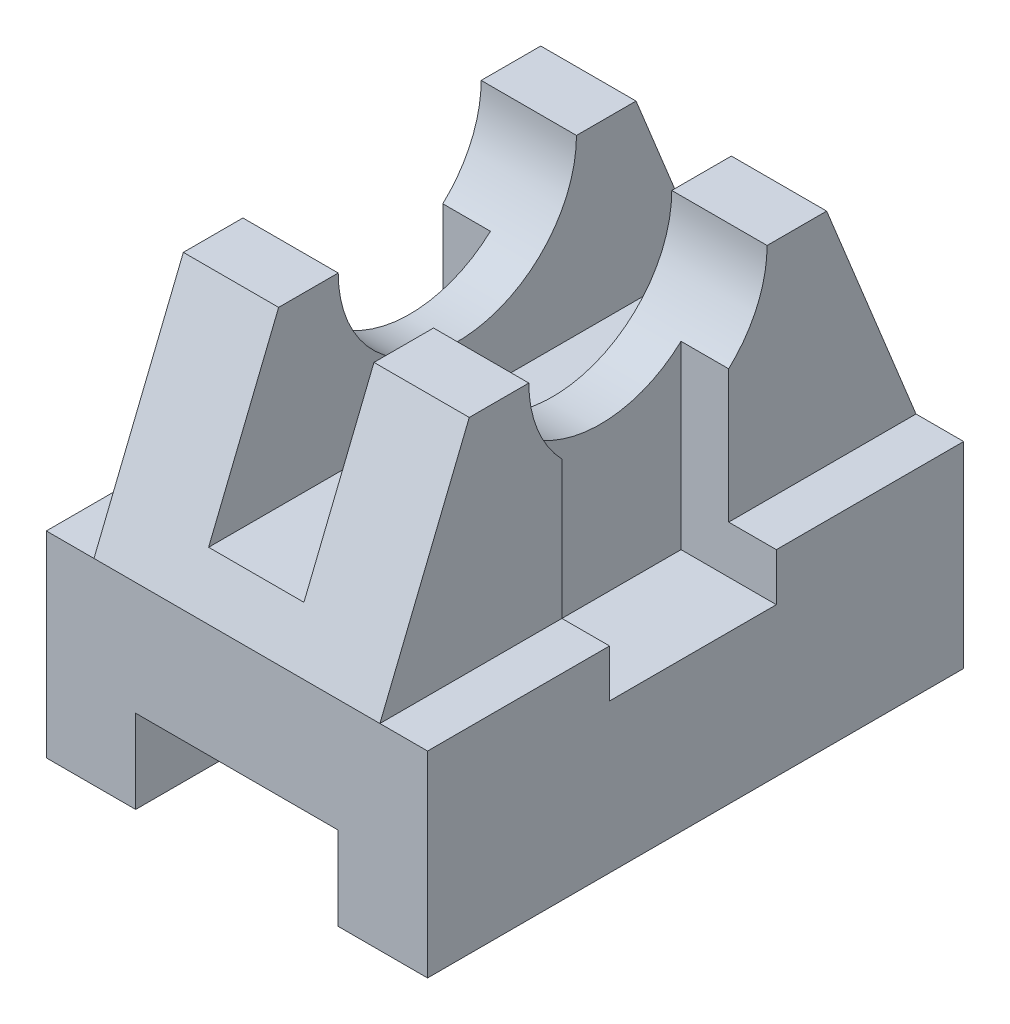
ISO-10303-21;
HEADER;
FILE_DESCRIPTION(('STEP AP214'),'2;1');
FILE_NAME('part.step','',(''),(''),'','','');
FILE_SCHEMA(('AUTOMOTIVE_DESIGN { 1 0 10303 214 1 1 1 1 }'));
ENDSEC;
DATA;
#1=APPLICATION_CONTEXT('core data for automotive mechanical design processes');
#2=APPLICATION_PROTOCOL_DEFINITION('international standard','automotive_design',2000,#1);
#3=PRODUCT_CONTEXT('',#1,'mechanical');
#4=PRODUCT('Part','Part','',(#3));
#5=PRODUCT_RELATED_PRODUCT_CATEGORY('part','',(#4));
#6=PRODUCT_DEFINITION_FORMATION('','',#4);
#7=PRODUCT_DEFINITION_CONTEXT('part definition',#1,'design');
#8=PRODUCT_DEFINITION('design','',#6,#7);
#9=PRODUCT_DEFINITION_SHAPE('','',#8);
#10=(LENGTH_UNIT() NAMED_UNIT(*) SI_UNIT(.MILLI.,.METRE.));
#11=(NAMED_UNIT(*) PLANE_ANGLE_UNIT() SI_UNIT($,.RADIAN.));
#12=(NAMED_UNIT(*) SI_UNIT($,.STERADIAN.) SOLID_ANGLE_UNIT());
#13=UNCERTAINTY_MEASURE_WITH_UNIT(LENGTH_MEASURE(1.E-05),#10,'distance_accuracy_value','');
#14=(GEOMETRIC_REPRESENTATION_CONTEXT(3) GLOBAL_UNCERTAINTY_ASSIGNED_CONTEXT((#13)) GLOBAL_UNIT_ASSIGNED_CONTEXT((#10,
#11,#12)) REPRESENTATION_CONTEXT('',''));
#15=CARTESIAN_POINT('',(0.,0.,0.));
#16=DIRECTION('',(0.,0.,1.));
#17=DIRECTION('',(1.,0.,0.));
#18=AXIS2_PLACEMENT_3D('',#15,#16,#17);
#19=CARTESIAN_POINT('',(48.,49.5,-135.));
#20=DIRECTION('',(0.,1.,0.));
#21=DIRECTION('',(-1.,0.,0.));
#22=AXIS2_PLACEMENT_3D('',#19,#20,#21);
#23=PLANE('',#22);
#24=DIRECTION('',(0.,0.,1.));
#25=VECTOR('',#24,1.);
#26=CARTESIAN_POINT('',(-48.,49.5,-135.));
#27=LINE('',#26,#25);
#28=CARTESIAN_POINT('',(-48.,49.5,-135.));
#29=VERTEX_POINT('',#28);
#30=CARTESIAN_POINT('',(-48.,49.5,-87.8287066394887));
#31=VERTEX_POINT('',#30);
#32=EDGE_CURVE('E468',#29,#31,#27,.T.);
#33=ORIENTED_EDGE('',*,*,#32,.T.);
#34=DIRECTION('',(1.,0.,0.));
#35=VECTOR('',#34,1.);
#36=CARTESIAN_POINT('',(48.,49.5,-87.8287066394886));
#37=LINE('',#36,#35);
#38=CARTESIAN_POINT('',(-36.,49.5,-87.8287066394887));
#39=VERTEX_POINT('',#38);
#40=EDGE_CURVE('E275',#31,#39,#37,.T.);
#41=ORIENTED_EDGE('',*,*,#40,.T.);
#42=DIRECTION('',(0.,0.,-1.));
#43=VECTOR('',#42,1.);
#44=CARTESIAN_POINT('',(-36.,49.5,0.));
#45=LINE('',#44,#43);
#46=CARTESIAN_POINT('',(-36.,49.5,-135.));
#47=VERTEX_POINT('',#46);
#48=EDGE_CURVE('E352',#39,#47,#45,.T.);
#49=ORIENTED_EDGE('',*,*,#48,.T.);
#50=DIRECTION('',(-1.,0.,0.));
#51=VECTOR('',#50,1.);
#52=CARTESIAN_POINT('',(48.,49.5,-135.));
#53=LINE('',#52,#51);
#54=EDGE_CURVE('E406',#47,#29,#53,.T.);
#55=ORIENTED_EDGE('',*,*,#54,.T.);
#56=EDGE_LOOP('',(#33,#41,#49,#55));
#57=FACE_BOUND('',#56,.T.);
#58=ADVANCED_FACE('F33',(#57),#23,.T.);
#59=CARTESIAN_POINT('',(-36.,49.5,0.));
#60=VERTEX_POINT('',#59);
#61=CARTESIAN_POINT('',(-36.,49.5,-45.8287066394887));
#62=VERTEX_POINT('',#61);
#63=EDGE_CURVE('E353',#60,#62,#45,.T.);
#64=ORIENTED_EDGE('',*,*,#63,.T.);
#65=DIRECTION('',(-1.,0.,0.));
#66=VECTOR('',#65,1.);
#67=CARTESIAN_POINT('',(48.,49.5,-45.8287066394887));
#68=LINE('',#67,#66);
#69=CARTESIAN_POINT('',(-48.,49.5,-45.8287066394887));
#70=VERTEX_POINT('',#69);
#71=EDGE_CURVE('E48',#62,#70,#68,.T.);
#72=ORIENTED_EDGE('',*,*,#71,.T.);
#73=CARTESIAN_POINT('',(-48.,49.5,0.));
#74=VERTEX_POINT('',#73);
#75=EDGE_CURVE('E262',#70,#74,#27,.T.);
#76=ORIENTED_EDGE('',*,*,#75,.T.);
#77=DIRECTION('',(-1.,0.,0.));
#78=VECTOR('',#77,1.);
#79=CARTESIAN_POINT('',(48.,49.5,0.));
#80=LINE('',#79,#78);
#81=EDGE_CURVE('E401',#60,#74,#80,.T.);
#82=ORIENTED_EDGE('',*,*,#81,.F.);
#83=EDGE_LOOP('',(#64,#72,#76,#82));
#84=FACE_BOUND('',#83,.T.);
#85=ADVANCED_FACE('F584',(#84),#23,.T.);
#86=CARTESIAN_POINT('',(-48.,49.5,-135.));
#87=DIRECTION('',(-1.,0.,0.));
#88=DIRECTION('',(0.,-1.,0.));
#89=AXIS2_PLACEMENT_3D('',#86,#87,#88);
#90=PLANE('',#89);
#91=DIRECTION('',(0.,0.,-1.));
#92=VECTOR('',#91,1.);
#93=CARTESIAN_POINT('',(-48.,37.5,-87.8287066394887));
#94=LINE('',#93,#92);
#95=CARTESIAN_POINT('',(-48.,37.5,-45.8287066394887));
#96=VERTEX_POINT('',#95);
#97=CARTESIAN_POINT('',(-48.,37.5,-87.8287066394887));
#98=VERTEX_POINT('',#97);
#99=EDGE_CURVE('E250',#96,#98,#94,.T.);
#100=ORIENTED_EDGE('',*,*,#99,.T.);
#101=DIRECTION('',(0.,1.,0.));
#102=VECTOR('',#101,1.);
#103=CARTESIAN_POINT('',(-48.,37.5,-87.8287066394887));
#104=LINE('',#103,#102);
#105=EDGE_CURVE('E271',#98,#31,#104,.T.);
#106=ORIENTED_EDGE('',*,*,#105,.T.);
#107=ORIENTED_EDGE('',*,*,#32,.F.);
#108=DIRECTION('',(0.,-1.,0.));
#109=VECTOR('',#108,1.);
#110=CARTESIAN_POINT('',(-48.,49.5,-135.));
#111=LINE('',#110,#109);
#112=CARTESIAN_POINT('',(-48.,0.,-135.));
#113=VERTEX_POINT('',#112);
#114=EDGE_CURVE('E405',#29,#113,#111,.T.);
#115=ORIENTED_EDGE('',*,*,#114,.T.);
#116=DIRECTION('',(0.,0.,1.));
#117=VECTOR('',#116,1.);
#118=CARTESIAN_POINT('',(-48.,0.,-135.));
#119=LINE('',#118,#117);
#120=CARTESIAN_POINT('',(-48.,0.,0.));
#121=VERTEX_POINT('',#120);
#122=EDGE_CURVE('E466',#113,#121,#119,.T.);
#123=ORIENTED_EDGE('',*,*,#122,.T.);
#124=DIRECTION('',(0.,-1.,0.));
#125=VECTOR('',#124,1.);
#126=CARTESIAN_POINT('',(-48.,49.5,0.));
#127=LINE('',#126,#125);
#128=EDGE_CURVE('E430',#74,#121,#127,.T.);
#129=ORIENTED_EDGE('',*,*,#128,.F.);
#130=ORIENTED_EDGE('',*,*,#75,.F.);
#131=DIRECTION('',(0.,1.,0.));
#132=VECTOR('',#131,1.);
#133=CARTESIAN_POINT('',(-48.,37.5,-45.8287066394887));
#134=LINE('',#133,#132);
#135=EDGE_CURVE('E244',#96,#70,#134,.T.);
#136=ORIENTED_EDGE('',*,*,#135,.F.);
#137=EDGE_LOOP('',(#100,#106,#107,#115,#123,#129,#130,#136));
#138=FACE_BOUND('',#137,.T.);
#139=ADVANCED_FACE('F260',(#138),#90,.T.);
#140=CARTESIAN_POINT('',(36.,105.,-67.5));
#141=DIRECTION('',(-1.,0.,0.));
#142=DIRECTION('',(0.,0.,1.));
#143=AXIS2_PLACEMENT_3D('',#140,#141,#142);
#144=CYLINDRICAL_SURFACE('',#143,30.);
#145=DIRECTION('',(-1.,0.,0.));
#146=VECTOR('',#145,1.);
#147=CARTESIAN_POINT('',(36.,82.9377316133266,-87.8287066394887));
#148=LINE('',#147,#146);
#149=CARTESIAN_POINT('',(-24.,82.9377316133266,-87.8287066394887));
#150=VERTEX_POINT('',#149);
#151=CARTESIAN_POINT('',(-36.,82.9377316133266,-87.8287066394887));
#152=VERTEX_POINT('',#151);
#153=EDGE_CURVE('E273',#150,#152,#148,.T.);
#154=ORIENTED_EDGE('',*,*,#153,.F.);
#155=CARTESIAN_POINT('',(-24.,105.,-67.5));
#156=DIRECTION('',(-1.,0.,0.));
#157=DIRECTION('',(0.,0.,1.));
#158=AXIS2_PLACEMENT_3D('',#155,#156,#157);
#159=CIRCLE('',#158,30.);
#160=CARTESIAN_POINT('',(-24.,84.2549995400661,-45.8287066394887));
#161=VERTEX_POINT('',#160);
#162=EDGE_CURVE('E11',#161,#150,#159,.F.);
#163=ORIENTED_EDGE('',*,*,#162,.F.);
#164=DIRECTION('',(-1.,0.,0.));
#165=VECTOR('',#164,1.);
#166=CARTESIAN_POINT('',(36.,84.2549995400661,-45.8287066394887));
#167=LINE('',#166,#165);
#168=CARTESIAN_POINT('',(-36.,84.2549995400661,-45.8287066394887));
#169=VERTEX_POINT('',#168);
#170=EDGE_CURVE('E269',#169,#161,#167,.F.);
#171=ORIENTED_EDGE('',*,*,#170,.F.);
#172=CARTESIAN_POINT('',(-36.,105.,-67.5));
#173=DIRECTION('',(-1.,0.,0.));
#174=DIRECTION('',(0.,0.,-1.));
#175=AXIS2_PLACEMENT_3D('',#172,#173,#174);
#176=CIRCLE('',#175,30.);
#177=CARTESIAN_POINT('',(-36.,105.,-37.5));
#178=VERTEX_POINT('',#177);
#179=EDGE_CURVE('E342',#169,#178,#176,.T.);
#180=ORIENTED_EDGE('',*,*,#179,.T.);
#181=DIRECTION('',(-1.,0.,0.));
#182=VECTOR('',#181,1.);
#183=CARTESIAN_POINT('',(36.,105.,-37.5));
#184=LINE('',#183,#182);
#185=CARTESIAN_POINT('',(-12.,105.,-37.5));
#186=VERTEX_POINT('',#185);
#187=EDGE_CURVE('E397',#186,#178,#184,.T.);
#188=ORIENTED_EDGE('',*,*,#187,.F.);
#189=CARTESIAN_POINT('',(-12.,105.,-67.5));
#190=DIRECTION('',(-1.,0.,0.));
#191=DIRECTION('',(0.,-1.,0.));
#192=AXIS2_PLACEMENT_3D('',#189,#190,#191);
#193=CIRCLE('',#192,30.);
#194=CARTESIAN_POINT('',(-12.,105.,-97.5));
#195=VERTEX_POINT('',#194);
#196=EDGE_CURVE('E327',#186,#195,#193,.F.);
#197=ORIENTED_EDGE('',*,*,#196,.T.);
#198=DIRECTION('',(-1.,0.,0.));
#199=VECTOR('',#198,1.);
#200=CARTESIAN_POINT('',(36.,105.,-97.5));
#201=LINE('',#200,#199);
#202=CARTESIAN_POINT('',(-36.,105.,-97.5));
#203=VERTEX_POINT('',#202);
#204=EDGE_CURVE('E379',#195,#203,#201,.T.);
#205=ORIENTED_EDGE('',*,*,#204,.T.);
#206=EDGE_CURVE('E343',#203,#152,#176,.T.);
#207=ORIENTED_EDGE('',*,*,#206,.T.);
#208=EDGE_LOOP('',(#154,#163,#171,#180,#188,#197,#205,#207));
#209=FACE_BOUND('',#208,.T.);
#210=ADVANCED_FACE('F520',(#209),#144,.F.);
#211=CARTESIAN_POINT('',(-36.,105.,-67.5));
#212=DIRECTION('',(1.,0.,0.));
#213=DIRECTION('',(0.,0.,-1.));
#214=AXIS2_PLACEMENT_3D('',#211,#212,#213);
#215=PLANE('',#214);
#216=DIRECTION('',(0.,-1.,0.));
#217=VECTOR('',#216,1.);
#218=CARTESIAN_POINT('',(-36.,105.,-87.8287066394887));
#219=LINE('',#218,#217);
#220=EDGE_CURVE('E41',#152,#39,#219,.T.);
#221=ORIENTED_EDGE('',*,*,#220,.F.);
#222=ORIENTED_EDGE('',*,*,#206,.F.);
#223=DIRECTION('',(0.,0.,1.));
#224=VECTOR('',#223,1.);
#225=CARTESIAN_POINT('',(-36.,105.,-97.5));
#226=LINE('',#225,#224);
#227=CARTESIAN_POINT('',(-36.,105.,-112.5));
#228=VERTEX_POINT('',#227);
#229=EDGE_CURVE('E359',#228,#203,#226,.T.);
#230=ORIENTED_EDGE('',*,*,#229,.F.);
#231=DIRECTION('',(0.,0.926739268223405,0.375705108739218));
#232=VECTOR('',#231,1.);
#233=CARTESIAN_POINT('',(-36.,49.5,-135.));
#234=LINE('',#233,#232);
#235=EDGE_CURVE('E356',#47,#228,#234,.T.);
#236=ORIENTED_EDGE('',*,*,#235,.F.);
#237=ORIENTED_EDGE('',*,*,#48,.F.);
#238=EDGE_LOOP('',(#221,#222,#230,#236,#237));
#239=FACE_BOUND('',#238,.T.);
#240=ADVANCED_FACE('F499',(#239),#215,.F.);
#241=DIRECTION('',(0.,1.,0.));
#242=VECTOR('',#241,1.);
#243=CARTESIAN_POINT('',(-36.,105.,-45.8287066394887));
#244=LINE('',#243,#242);
#245=EDGE_CURVE('E486',#62,#169,#244,.T.);
#246=ORIENTED_EDGE('',*,*,#245,.F.);
#247=ORIENTED_EDGE('',*,*,#63,.F.);
#248=DIRECTION('',(0.,-0.926739268223405,0.375705108739218));
#249=VECTOR('',#248,1.);
#250=CARTESIAN_POINT('',(-36.,105.,-22.5));
#251=LINE('',#250,#249);
#252=CARTESIAN_POINT('',(-36.,105.,-22.5));
#253=VERTEX_POINT('',#252);
#254=EDGE_CURVE('E349',#253,#60,#251,.T.);
#255=ORIENTED_EDGE('',*,*,#254,.F.);
#256=DIRECTION('',(0.,0.,1.));
#257=VECTOR('',#256,1.);
#258=CARTESIAN_POINT('',(-36.,105.,-37.5));
#259=LINE('',#258,#257);
#260=EDGE_CURVE('E346',#178,#253,#259,.T.);
#261=ORIENTED_EDGE('',*,*,#260,.F.);
#262=ORIENTED_EDGE('',*,*,#179,.F.);
#263=EDGE_LOOP('',(#246,#247,#255,#261,#262));
#264=FACE_BOUND('',#263,.T.);
#265=ADVANCED_FACE('F538',(#264),#215,.F.);
#266=DIRECTION('',(1.,0.,0.));
#267=VECTOR('',#266,1.);
#268=CARTESIAN_POINT('',(48.,49.5,-45.8287066394887));
#269=LINE('',#268,#267);
#270=CARTESIAN_POINT('',(36.,49.5,-45.8287066394887));
#271=VERTEX_POINT('',#270);
#272=CARTESIAN_POINT('',(48.,49.5,-45.8287066394887));
#273=VERTEX_POINT('',#272);
#274=EDGE_CURVE('E305',#271,#273,#269,.T.);
#275=ORIENTED_EDGE('',*,*,#274,.F.);
#276=DIRECTION('',(0.,0.,-1.));
#277=VECTOR('',#276,1.);
#278=CARTESIAN_POINT('',(36.,49.5,0.));
#279=LINE('',#278,#277);
#280=CARTESIAN_POINT('',(36.,49.5,0.));
#281=VERTEX_POINT('',#280);
#282=EDGE_CURVE('E372',#281,#271,#279,.T.);
#283=ORIENTED_EDGE('',*,*,#282,.F.);
#284=CARTESIAN_POINT('',(48.,49.5,0.));
#285=VERTEX_POINT('',#284);
#286=EDGE_CURVE('E427',#285,#281,#80,.T.);
#287=ORIENTED_EDGE('',*,*,#286,.F.);
#288=DIRECTION('',(0.,0.,1.));
#289=VECTOR('',#288,1.);
#290=CARTESIAN_POINT('',(48.,49.5,-135.));
#291=LINE('',#290,#289);
#292=EDGE_CURVE('E455',#273,#285,#291,.T.);
#293=ORIENTED_EDGE('',*,*,#292,.F.);
#294=EDGE_LOOP('',(#275,#283,#287,#293));
#295=FACE_BOUND('',#294,.T.);
#296=ADVANCED_FACE('F586',(#295),#23,.T.);
#297=CARTESIAN_POINT('',(36.,105.,-67.5));
#298=DIRECTION('',(1.,0.,0.));
#299=DIRECTION('',(0.,0.,-1.));
#300=AXIS2_PLACEMENT_3D('',#297,#298,#299);
#301=PLANE('',#300);
#302=DIRECTION('',(0.,-1.,0.));
#303=VECTOR('',#302,1.);
#304=CARTESIAN_POINT('',(36.,105.,-45.8287066394887));
#305=LINE('',#304,#303);
#306=CARTESIAN_POINT('',(36.,84.2549995400661,-45.8287066394887));
#307=VERTEX_POINT('',#306);
#308=EDGE_CURVE('E481',#307,#271,#305,.T.);
#309=ORIENTED_EDGE('',*,*,#308,.F.);
#310=CARTESIAN_POINT('',(36.,105.,-67.5));
#311=DIRECTION('',(-1.,0.,0.));
#312=DIRECTION('',(0.,0.,-1.));
#313=AXIS2_PLACEMENT_3D('',#310,#311,#312);
#314=CIRCLE('',#313,30.);
#315=CARTESIAN_POINT('',(36.,105.,-37.5));
#316=VERTEX_POINT('',#315);
#317=EDGE_CURVE('E362',#307,#316,#314,.T.);
#318=ORIENTED_EDGE('',*,*,#317,.T.);
#319=DIRECTION('',(0.,0.,1.));
#320=VECTOR('',#319,1.);
#321=CARTESIAN_POINT('',(36.,105.,-37.5));
#322=LINE('',#321,#320);
#323=CARTESIAN_POINT('',(36.,105.,-22.5));
#324=VERTEX_POINT('',#323);
#325=EDGE_CURVE('E366',#316,#324,#322,.T.);
#326=ORIENTED_EDGE('',*,*,#325,.T.);
#327=DIRECTION('',(0.,-0.926739268223405,0.375705108739218));
#328=VECTOR('',#327,1.);
#329=CARTESIAN_POINT('',(36.,105.,-22.5));
#330=LINE('',#329,#328);
#331=EDGE_CURVE('E368',#324,#281,#330,.T.);
#332=ORIENTED_EDGE('',*,*,#331,.T.);
#333=ORIENTED_EDGE('',*,*,#282,.T.);
#334=EDGE_LOOP('',(#309,#318,#326,#332,#333));
#335=FACE_BOUND('',#334,.T.);
#336=ADVANCED_FACE('F592',(#335),#301,.T.);
#337=ORIENTED_EDGE('',*,*,#317,.F.);
#338=DIRECTION('',(-1.,0.,0.));
#339=VECTOR('',#338,1.);
#340=CARTESIAN_POINT('',(36.,84.2549995400661,-45.8287066394887));
#341=LINE('',#340,#339);
#342=CARTESIAN_POINT('',(24.,84.2549995400661,-45.8287066394887));
#343=VERTEX_POINT('',#342);
#344=EDGE_CURVE('E307',#307,#343,#341,.T.);
#345=ORIENTED_EDGE('',*,*,#344,.T.);
#346=CARTESIAN_POINT('',(24.,105.,-67.5));
#347=DIRECTION('',(-1.,0.,0.));
#348=DIRECTION('',(0.,0.,1.));
#349=AXIS2_PLACEMENT_3D('',#346,#347,#348);
#350=CIRCLE('',#349,30.);
#351=CARTESIAN_POINT('',(24.,82.9377316133266,-87.8287066394887));
#352=VERTEX_POINT('',#351);
#353=EDGE_CURVE('E483',#343,#352,#350,.F.);
#354=ORIENTED_EDGE('',*,*,#353,.T.);
#355=DIRECTION('',(-1.,0.,0.));
#356=VECTOR('',#355,1.);
#357=CARTESIAN_POINT('',(36.,82.9377316133266,-87.8287066394887));
#358=LINE('',#357,#356);
#359=CARTESIAN_POINT('',(36.,82.9377316133266,-87.8287066394887));
#360=VERTEX_POINT('',#359);
#361=EDGE_CURVE('E302',#352,#360,#358,.F.);
#362=ORIENTED_EDGE('',*,*,#361,.T.);
#363=CARTESIAN_POINT('',(36.,105.,-97.5));
#364=VERTEX_POINT('',#363);
#365=EDGE_CURVE('E363',#364,#360,#314,.T.);
#366=ORIENTED_EDGE('',*,*,#365,.F.);
#367=CARTESIAN_POINT('',(12.,105.,-97.5));
#368=VERTEX_POINT('',#367);
#369=EDGE_CURVE('E380',#364,#368,#201,.T.);
#370=ORIENTED_EDGE('',*,*,#369,.T.);
#371=CARTESIAN_POINT('',(12.,105.,-67.5));
#372=DIRECTION('',(1.,0.,0.));
#373=DIRECTION('',(0.,1.,0.));
#374=AXIS2_PLACEMENT_3D('',#371,#372,#373);
#375=CIRCLE('',#374,30.);
#376=CARTESIAN_POINT('',(12.,105.,-37.5));
#377=VERTEX_POINT('',#376);
#378=EDGE_CURVE('E336',#368,#377,#375,.F.);
#379=ORIENTED_EDGE('',*,*,#378,.T.);
#380=EDGE_CURVE('E398',#316,#377,#184,.T.);
#381=ORIENTED_EDGE('',*,*,#380,.F.);
#382=EDGE_LOOP('',(#337,#345,#354,#362,#366,#370,#379,#381));
#383=FACE_BOUND('',#382,.T.);
#384=ADVANCED_FACE('F598',(#383),#144,.F.);
#385=CARTESIAN_POINT('',(36.,105.,-37.5));
#386=DIRECTION('',(0.,-1.,0.));
#387=DIRECTION('',(0.,0.,-1.));
#388=AXIS2_PLACEMENT_3D('',#385,#386,#387);
#389=PLANE('',#388);
#390=ORIENTED_EDGE('',*,*,#380,.T.);
#391=DIRECTION('',(0.,0.,1.));
#392=VECTOR('',#391,1.);
#393=CARTESIAN_POINT('',(12.,105.,-135.));
#394=LINE('',#393,#392);
#395=CARTESIAN_POINT('',(12.,105.,-22.5));
#396=VERTEX_POINT('',#395);
#397=EDGE_CURVE('E310',#377,#396,#394,.T.);
#398=ORIENTED_EDGE('',*,*,#397,.T.);
#399=DIRECTION('',(-1.,0.,0.));
#400=VECTOR('',#399,1.);
#401=CARTESIAN_POINT('',(36.,105.,-22.5));
#402=LINE('',#401,#400);
#403=EDGE_CURVE('E394',#324,#396,#402,.T.);
#404=ORIENTED_EDGE('',*,*,#403,.F.);
#405=ORIENTED_EDGE('',*,*,#325,.F.);
#406=EDGE_LOOP('',(#390,#398,#404,#405));
#407=FACE_BOUND('',#406,.T.);
#408=ADVANCED_FACE('F610',(#407),#389,.F.);
#409=CARTESIAN_POINT('',(36.,105.,-97.5));
#410=DIRECTION('',(0.,-1.,0.));
#411=DIRECTION('',(0.,0.,-1.));
#412=AXIS2_PLACEMENT_3D('',#409,#410,#411);
#413=PLANE('',#412);
#414=DIRECTION('',(-1.,0.,0.));
#415=VECTOR('',#414,1.);
#416=CARTESIAN_POINT('',(36.,105.,-112.5));
#417=LINE('',#416,#415);
#418=CARTESIAN_POINT('',(36.,105.,-112.5));
#419=VERTEX_POINT('',#418);
#420=CARTESIAN_POINT('',(12.,105.,-112.5));
#421=VERTEX_POINT('',#420);
#422=EDGE_CURVE('E384',#419,#421,#417,.T.);
#423=ORIENTED_EDGE('',*,*,#422,.T.);
#424=DIRECTION('',(0.,0.,1.));
#425=VECTOR('',#424,1.);
#426=CARTESIAN_POINT('',(12.,105.,-97.5));
#427=LINE('',#426,#425);
#428=EDGE_CURVE('E473',#421,#368,#427,.T.);
#429=ORIENTED_EDGE('',*,*,#428,.T.);
#430=ORIENTED_EDGE('',*,*,#369,.F.);
#431=DIRECTION('',(0.,0.,1.));
#432=VECTOR('',#431,1.);
#433=CARTESIAN_POINT('',(36.,105.,-97.5));
#434=LINE('',#433,#432);
#435=EDGE_CURVE('E377',#419,#364,#434,.T.);
#436=ORIENTED_EDGE('',*,*,#435,.F.);
#437=EDGE_LOOP('',(#423,#429,#430,#436));
#438=FACE_BOUND('',#437,.T.);
#439=ADVANCED_FACE('F550',(#438),#413,.F.);
#440=DIRECTION('',(-1.,0.,0.));
#441=VECTOR('',#440,1.);
#442=CARTESIAN_POINT('',(48.,49.5,-87.8287066394887));
#443=LINE('',#442,#441);
#444=CARTESIAN_POINT('',(48.,49.5,-87.8287066394887));
#445=VERTEX_POINT('',#444);
#446=CARTESIAN_POINT('',(36.,49.5,-87.8287066394887));
#447=VERTEX_POINT('',#446);
#448=EDGE_CURVE('E56',#445,#447,#443,.T.);
#449=ORIENTED_EDGE('',*,*,#448,.F.);
#450=CARTESIAN_POINT('',(48.,49.5,-135.));
#451=VERTEX_POINT('',#450);
#452=EDGE_CURVE('E451',#451,#445,#291,.T.);
#453=ORIENTED_EDGE('',*,*,#452,.F.);
#454=CARTESIAN_POINT('',(36.,49.5,-135.));
#455=VERTEX_POINT('',#454);
#456=EDGE_CURVE('E402',#451,#455,#53,.T.);
#457=ORIENTED_EDGE('',*,*,#456,.T.);
#458=EDGE_CURVE('E371',#447,#455,#279,.T.);
#459=ORIENTED_EDGE('',*,*,#458,.F.);
#460=EDGE_LOOP('',(#449,#453,#457,#459));
#461=FACE_BOUND('',#460,.T.);
#462=ADVANCED_FACE('F35',(#461),#23,.T.);
#463=CARTESIAN_POINT('',(48.,0.,-135.));
#464=DIRECTION('',(1.,0.,0.));
#465=DIRECTION('',(0.,0.,-1.));
#466=AXIS2_PLACEMENT_3D('',#463,#464,#465);
#467=PLANE('',#466);
#468=DIRECTION('',(0.,1.,0.));
#469=VECTOR('',#468,1.);
#470=CARTESIAN_POINT('',(48.,37.5,-45.8287066394887));
#471=LINE('',#470,#469);
#472=CARTESIAN_POINT('',(48.,37.5,-45.8287066394887));
#473=VERTEX_POINT('',#472);
#474=EDGE_CURVE('E291',#473,#273,#471,.T.);
#475=ORIENTED_EDGE('',*,*,#474,.T.);
#476=ORIENTED_EDGE('',*,*,#292,.T.);
#477=DIRECTION('',(0.,1.,0.));
#478=VECTOR('',#477,1.);
#479=CARTESIAN_POINT('',(48.,0.,0.));
#480=LINE('',#479,#478);
#481=CARTESIAN_POINT('',(48.,0.,0.));
#482=VERTEX_POINT('',#481);
#483=EDGE_CURVE('E448',#482,#285,#480,.T.);
#484=ORIENTED_EDGE('',*,*,#483,.F.);
#485=DIRECTION('',(0.,0.,1.));
#486=VECTOR('',#485,1.);
#487=CARTESIAN_POINT('',(48.,0.,-135.));
#488=LINE('',#487,#486);
#489=CARTESIAN_POINT('',(48.,0.,-135.));
#490=VERTEX_POINT('',#489);
#491=EDGE_CURVE('E456',#490,#482,#488,.T.);
#492=ORIENTED_EDGE('',*,*,#491,.F.);
#493=DIRECTION('',(0.,1.,0.));
#494=VECTOR('',#493,1.);
#495=CARTESIAN_POINT('',(48.,0.,-135.));
#496=LINE('',#495,#494);
#497=EDGE_CURVE('E424',#490,#451,#496,.T.);
#498=ORIENTED_EDGE('',*,*,#497,.T.);
#499=ORIENTED_EDGE('',*,*,#452,.T.);
#500=DIRECTION('',(0.,1.,0.));
#501=VECTOR('',#500,1.);
#502=CARTESIAN_POINT('',(48.,37.5,-87.8287066394887));
#503=LINE('',#502,#501);
#504=CARTESIAN_POINT('',(48.,37.5,-87.8287066394887));
#505=VERTEX_POINT('',#504);
#506=EDGE_CURVE('E290',#505,#445,#503,.T.);
#507=ORIENTED_EDGE('',*,*,#506,.F.);
#508=DIRECTION('',(0.,0.,-1.));
#509=VECTOR('',#508,1.);
#510=CARTESIAN_POINT('',(48.,37.5,-87.8287066394887));
#511=LINE('',#510,#509);
#512=EDGE_CURVE('E278',#473,#505,#511,.T.);
#513=ORIENTED_EDGE('',*,*,#512,.F.);
#514=EDGE_LOOP('',(#475,#476,#484,#492,#498,#499,#507,#513));
#515=FACE_BOUND('',#514,.T.);
#516=ADVANCED_FACE('F559',(#515),#467,.T.);
#517=CARTESIAN_POINT('',(25.5,0.,-135.));
#518=DIRECTION('',(0.,-1.,0.));
#519=DIRECTION('',(0.,0.,-1.));
#520=AXIS2_PLACEMENT_3D('',#517,#518,#519);
#521=PLANE('',#520);
#522=DIRECTION('',(1.,0.,0.));
#523=VECTOR('',#522,1.);
#524=CARTESIAN_POINT('',(25.5,0.,0.));
#525=LINE('',#524,#523);
#526=CARTESIAN_POINT('',(25.5,0.,0.));
#527=VERTEX_POINT('',#526);
#528=EDGE_CURVE('E445',#527,#482,#525,.T.);
#529=ORIENTED_EDGE('',*,*,#528,.F.);
#530=DIRECTION('',(0.,0.,1.));
#531=VECTOR('',#530,1.);
#532=CARTESIAN_POINT('',(25.5,0.,-135.));
#533=LINE('',#532,#531);
#534=CARTESIAN_POINT('',(25.5,0.,-135.));
#535=VERTEX_POINT('',#534);
#536=EDGE_CURVE('E458',#535,#527,#533,.T.);
#537=ORIENTED_EDGE('',*,*,#536,.F.);
#538=DIRECTION('',(1.,0.,0.));
#539=VECTOR('',#538,1.);
#540=CARTESIAN_POINT('',(25.5,0.,-135.));
#541=LINE('',#540,#539);
#542=EDGE_CURVE('E421',#535,#490,#541,.T.);
#543=ORIENTED_EDGE('',*,*,#542,.T.);
#544=ORIENTED_EDGE('',*,*,#491,.T.);
#545=EDGE_LOOP('',(#529,#537,#543,#544));
#546=FACE_BOUND('',#545,.T.);
#547=ADVANCED_FACE('F608',(#546),#521,.T.);
#548=CARTESIAN_POINT('',(25.5,21.,-135.));
#549=DIRECTION('',(-1.,0.,0.));
#550=DIRECTION('',(0.,-1.,0.));
#551=AXIS2_PLACEMENT_3D('',#548,#549,#550);
#552=PLANE('',#551);
#553=DIRECTION('',(0.,-1.,0.));
#554=VECTOR('',#553,1.);
#555=CARTESIAN_POINT('',(25.5,21.,0.));
#556=LINE('',#555,#554);
#557=CARTESIAN_POINT('',(25.5,21.,0.));
#558=VERTEX_POINT('',#557);
#559=EDGE_CURVE('E442',#558,#527,#556,.T.);
#560=ORIENTED_EDGE('',*,*,#559,.F.);
#561=DIRECTION('',(0.,0.,1.));
#562=VECTOR('',#561,1.);
#563=CARTESIAN_POINT('',(25.5,21.,-135.));
#564=LINE('',#563,#562);
#565=CARTESIAN_POINT('',(25.5,21.,-135.));
#566=VERTEX_POINT('',#565);
#567=EDGE_CURVE('E460',#566,#558,#564,.T.);
#568=ORIENTED_EDGE('',*,*,#567,.F.);
#569=DIRECTION('',(0.,-1.,0.));
#570=VECTOR('',#569,1.);
#571=CARTESIAN_POINT('',(25.5,21.,-135.));
#572=LINE('',#571,#570);
#573=EDGE_CURVE('E418',#566,#535,#572,.T.);
#574=ORIENTED_EDGE('',*,*,#573,.T.);
#575=ORIENTED_EDGE('',*,*,#536,.T.);
#576=EDGE_LOOP('',(#560,#568,#574,#575));
#577=FACE_BOUND('',#576,.T.);
#578=ADVANCED_FACE('F568',(#577),#552,.T.);
#579=CARTESIAN_POINT('',(-25.5,21.,-135.));
#580=DIRECTION('',(0.,-1.,0.));
#581=DIRECTION('',(0.,0.,-1.));
#582=AXIS2_PLACEMENT_3D('',#579,#580,#581);
#583=PLANE('',#582);
#584=DIRECTION('',(1.,0.,0.));
#585=VECTOR('',#584,1.);
#586=CARTESIAN_POINT('',(-25.5,21.,0.));
#587=LINE('',#586,#585);
#588=CARTESIAN_POINT('',(-25.5,21.,0.));
#589=VERTEX_POINT('',#588);
#590=EDGE_CURVE('E439',#589,#558,#587,.T.);
#591=ORIENTED_EDGE('',*,*,#590,.F.);
#592=DIRECTION('',(0.,0.,1.));
#593=VECTOR('',#592,1.);
#594=CARTESIAN_POINT('',(-25.5,21.,-135.));
#595=LINE('',#594,#593);
#596=CARTESIAN_POINT('',(-25.5,21.,-135.));
#597=VERTEX_POINT('',#596);
#598=EDGE_CURVE('E462',#597,#589,#595,.T.);
#599=ORIENTED_EDGE('',*,*,#598,.F.);
#600=DIRECTION('',(1.,0.,0.));
#601=VECTOR('',#600,1.);
#602=CARTESIAN_POINT('',(-25.5,21.,-135.));
#603=LINE('',#602,#601);
#604=EDGE_CURVE('E415',#597,#566,#603,.T.);
#605=ORIENTED_EDGE('',*,*,#604,.T.);
#606=ORIENTED_EDGE('',*,*,#567,.T.);
#607=EDGE_LOOP('',(#591,#599,#605,#606));
#608=FACE_BOUND('',#607,.T.);
#609=ADVANCED_FACE('F572',(#608),#583,.T.);
#610=CARTESIAN_POINT('',(-25.5,0.,-135.));
#611=DIRECTION('',(1.,0.,0.));
#612=DIRECTION('',(0.,1.,0.));
#613=AXIS2_PLACEMENT_3D('',#610,#611,#612);
#614=PLANE('',#613);
#615=DIRECTION('',(0.,1.,0.));
#616=VECTOR('',#615,1.);
#617=CARTESIAN_POINT('',(-25.5,0.,0.));
#618=LINE('',#617,#616);
#619=CARTESIAN_POINT('',(-25.5,0.,0.));
#620=VERTEX_POINT('',#619);
#621=EDGE_CURVE('E436',#620,#589,#618,.T.);
#622=ORIENTED_EDGE('',*,*,#621,.F.);
#623=DIRECTION('',(0.,0.,1.));
#624=VECTOR('',#623,1.);
#625=CARTESIAN_POINT('',(-25.5,0.,-135.));
#626=LINE('',#625,#624);
#627=CARTESIAN_POINT('',(-25.5,0.,-135.));
#628=VERTEX_POINT('',#627);
#629=EDGE_CURVE('E464',#628,#620,#626,.T.);
#630=ORIENTED_EDGE('',*,*,#629,.F.);
#631=DIRECTION('',(0.,1.,0.));
#632=VECTOR('',#631,1.);
#633=CARTESIAN_POINT('',(-25.5,0.,-135.));
#634=LINE('',#633,#632);
#635=EDGE_CURVE('E412',#628,#597,#634,.T.);
#636=ORIENTED_EDGE('',*,*,#635,.T.);
#637=ORIENTED_EDGE('',*,*,#598,.T.);
#638=EDGE_LOOP('',(#622,#630,#636,#637));
#639=FACE_BOUND('',#638,.T.);
#640=ADVANCED_FACE('F576',(#639),#614,.T.);
#641=CARTESIAN_POINT('',(-48.,0.,-135.));
#642=DIRECTION('',(0.,-1.,0.));
#643=DIRECTION('',(1.,0.,0.));
#644=AXIS2_PLACEMENT_3D('',#641,#642,#643);
#645=PLANE('',#644);
#646=DIRECTION('',(1.,0.,0.));
#647=VECTOR('',#646,1.);
#648=CARTESIAN_POINT('',(-48.,0.,0.));
#649=LINE('',#648,#647);
#650=EDGE_CURVE('E433',#121,#620,#649,.T.);
#651=ORIENTED_EDGE('',*,*,#650,.F.);
#652=ORIENTED_EDGE('',*,*,#122,.F.);
#653=DIRECTION('',(1.,0.,0.));
#654=VECTOR('',#653,1.);
#655=CARTESIAN_POINT('',(-48.,0.,-135.));
#656=LINE('',#655,#654);
#657=EDGE_CURVE('E409',#113,#628,#656,.T.);
#658=ORIENTED_EDGE('',*,*,#657,.T.);
#659=ORIENTED_EDGE('',*,*,#629,.T.);
#660=EDGE_LOOP('',(#651,#652,#658,#659));
#661=FACE_BOUND('',#660,.T.);
#662=ADVANCED_FACE('F579',(#661),#645,.T.);
#663=CARTESIAN_POINT('',(0.,0.,-135.));
#664=DIRECTION('',(0.,0.,1.));
#665=DIRECTION('',(1.,0.,0.));
#666=AXIS2_PLACEMENT_3D('',#663,#664,#665);
#667=PLANE('',#666);
#668=ORIENTED_EDGE('',*,*,#456,.F.);
#669=ORIENTED_EDGE('',*,*,#497,.F.);
#670=ORIENTED_EDGE('',*,*,#542,.F.);
#671=ORIENTED_EDGE('',*,*,#573,.F.);
#672=ORIENTED_EDGE('',*,*,#604,.F.);
#673=ORIENTED_EDGE('',*,*,#635,.F.);
#674=ORIENTED_EDGE('',*,*,#657,.F.);
#675=ORIENTED_EDGE('',*,*,#114,.F.);
#676=ORIENTED_EDGE('',*,*,#54,.F.);
#677=DIRECTION('',(-1.,0.,0.));
#678=VECTOR('',#677,1.);
#679=CARTESIAN_POINT('',(36.,49.5,-135.));
#680=LINE('',#679,#678);
#681=EDGE_CURVE('E387',#455,#47,#680,.T.);
#682=ORIENTED_EDGE('',*,*,#681,.F.);
#683=EDGE_LOOP('',(#668,#669,#670,#671,#672,#673,#674,#675,#676,#682));
#684=FACE_BOUND('',#683,.T.);
#685=ADVANCED_FACE('F509',(#684),#667,.F.);
#686=CARTESIAN_POINT('',(0.,0.,0.));
#687=DIRECTION('',(0.,0.,1.));
#688=DIRECTION('',(1.,0.,0.));
#689=AXIS2_PLACEMENT_3D('',#686,#687,#688);
#690=PLANE('',#689);
#691=ORIENTED_EDGE('',*,*,#286,.T.);
#692=DIRECTION('',(-1.,0.,0.));
#693=VECTOR('',#692,1.);
#694=CARTESIAN_POINT('',(36.,49.5,0.));
#695=LINE('',#694,#693);
#696=EDGE_CURVE('E390',#281,#60,#695,.T.);
#697=ORIENTED_EDGE('',*,*,#696,.T.);
#698=ORIENTED_EDGE('',*,*,#81,.T.);
#699=ORIENTED_EDGE('',*,*,#128,.T.);
#700=ORIENTED_EDGE('',*,*,#650,.T.);
#701=ORIENTED_EDGE('',*,*,#621,.T.);
#702=ORIENTED_EDGE('',*,*,#590,.T.);
#703=ORIENTED_EDGE('',*,*,#559,.T.);
#704=ORIENTED_EDGE('',*,*,#528,.T.);
#705=ORIENTED_EDGE('',*,*,#483,.T.);
#706=EDGE_LOOP('',(#691,#697,#698,#699,#700,#701,#702,#703,#704,#705));
#707=FACE_BOUND('',#706,.T.);
#708=ADVANCED_FACE('F582',(#707),#690,.T.);
#709=CARTESIAN_POINT('',(-12.,105.,-22.5));
#710=VERTEX_POINT('',#709);
#711=EDGE_CURVE('E393',#710,#253,#402,.T.);
#712=ORIENTED_EDGE('',*,*,#711,.F.);
#713=DIRECTION('',(0.,0.,1.));
#714=VECTOR('',#713,1.);
#715=CARTESIAN_POINT('',(-12.,105.,-135.));
#716=LINE('',#715,#714);
#717=EDGE_CURVE('E318',#186,#710,#716,.T.);
#718=ORIENTED_EDGE('',*,*,#717,.F.);
#719=ORIENTED_EDGE('',*,*,#187,.T.);
#720=ORIENTED_EDGE('',*,*,#260,.T.);
#721=EDGE_LOOP('',(#712,#718,#719,#720));
#722=FACE_BOUND('',#721,.T.);
#723=ADVANCED_FACE('F535',(#722),#389,.F.);
#724=CARTESIAN_POINT('',(36.,105.,-22.5));
#725=DIRECTION('',(0.,-0.375705108739218,-0.926739268223405));
#726=DIRECTION('',(0.,0.926739268223405,-0.375705108739218));
#727=AXIS2_PLACEMENT_3D('',#724,#725,#726);
#728=PLANE('',#727);
#729=ORIENTED_EDGE('',*,*,#403,.T.);
#730=DIRECTION('',(0.,-0.926739268223405,0.375705108739218));
#731=VECTOR('',#730,1.);
#732=CARTESIAN_POINT('',(12.,105.,-22.5));
#733=LINE('',#732,#731);
#734=CARTESIAN_POINT('',(12.,61.5,-4.86486486486487));
#735=VERTEX_POINT('',#734);
#736=EDGE_CURVE('E333',#396,#735,#733,.T.);
#737=ORIENTED_EDGE('',*,*,#736,.T.);
#738=DIRECTION('',(-1.,0.,0.));
#739=VECTOR('',#738,1.);
#740=CARTESIAN_POINT('',(36.,61.5,-4.86486486486487));
#741=LINE('',#740,#739);
#742=CARTESIAN_POINT('',(-12.,61.5,-4.86486486486488));
#743=VERTEX_POINT('',#742);
#744=EDGE_CURVE('E339',#735,#743,#741,.T.);
#745=ORIENTED_EDGE('',*,*,#744,.T.);
#746=DIRECTION('',(0.,0.926739268223405,-0.375705108739218));
#747=VECTOR('',#746,1.);
#748=CARTESIAN_POINT('',(-12.,105.,-22.5));
#749=LINE('',#748,#747);
#750=EDGE_CURVE('E324',#743,#710,#749,.T.);
#751=ORIENTED_EDGE('',*,*,#750,.T.);
#752=ORIENTED_EDGE('',*,*,#711,.T.);
#753=ORIENTED_EDGE('',*,*,#254,.T.);
#754=ORIENTED_EDGE('',*,*,#696,.F.);
#755=ORIENTED_EDGE('',*,*,#331,.F.);
#756=EDGE_LOOP('',(#729,#737,#745,#751,#752,#753,#754,#755));
#757=FACE_BOUND('',#756,.T.);
#758=ADVANCED_FACE('F542',(#757),#728,.F.);
#759=CARTESIAN_POINT('',(36.,49.5,-135.));
#760=DIRECTION('',(0.,-0.375705108739218,0.926739268223405));
#761=DIRECTION('',(0.,-0.926739268223405,-0.375705108739218));
#762=AXIS2_PLACEMENT_3D('',#759,#760,#761);
#763=PLANE('',#762);
#764=DIRECTION('',(1.,0.,0.));
#765=VECTOR('',#764,1.);
#766=CARTESIAN_POINT('',(36.,61.5,-130.135135135135));
#767=LINE('',#766,#765);
#768=CARTESIAN_POINT('',(-12.,61.5,-130.135135135135));
#769=VERTEX_POINT('',#768);
#770=CARTESIAN_POINT('',(12.,61.5,-130.135135135135));
#771=VERTEX_POINT('',#770);
#772=EDGE_CURVE('E476',#769,#771,#767,.T.);
#773=ORIENTED_EDGE('',*,*,#772,.T.);
#774=DIRECTION('',(0.,0.926739268223405,0.375705108739218));
#775=VECTOR('',#774,1.);
#776=CARTESIAN_POINT('',(12.,49.5,-135.));
#777=LINE('',#776,#775);
#778=EDGE_CURVE('E330',#771,#421,#777,.T.);
#779=ORIENTED_EDGE('',*,*,#778,.T.);
#780=ORIENTED_EDGE('',*,*,#422,.F.);
#781=DIRECTION('',(0.,0.926739268223405,0.375705108739218));
#782=VECTOR('',#781,1.);
#783=CARTESIAN_POINT('',(36.,49.5,-135.));
#784=LINE('',#783,#782);
#785=EDGE_CURVE('E375',#455,#419,#784,.T.);
#786=ORIENTED_EDGE('',*,*,#785,.F.);
#787=ORIENTED_EDGE('',*,*,#681,.T.);
#788=ORIENTED_EDGE('',*,*,#235,.T.);
#789=CARTESIAN_POINT('',(-12.,105.,-112.5));
#790=VERTEX_POINT('',#789);
#791=EDGE_CURVE('E383',#790,#228,#417,.T.);
#792=ORIENTED_EDGE('',*,*,#791,.F.);
#793=DIRECTION('',(0.,-0.926739268223405,-0.375705108739218));
#794=VECTOR('',#793,1.);
#795=CARTESIAN_POINT('',(-12.,49.5,-135.));
#796=LINE('',#795,#794);
#797=EDGE_CURVE('E314',#790,#769,#796,.T.);
#798=ORIENTED_EDGE('',*,*,#797,.T.);
#799=EDGE_LOOP('',(#773,#779,#780,#786,#787,#788,#792,#798));
#800=FACE_BOUND('',#799,.T.);
#801=ADVANCED_FACE('F503',(#800),#763,.F.);
#802=ORIENTED_EDGE('',*,*,#204,.F.);
#803=DIRECTION('',(0.,0.,-1.));
#804=VECTOR('',#803,1.);
#805=CARTESIAN_POINT('',(-12.,105.,-97.5));
#806=LINE('',#805,#804);
#807=EDGE_CURVE('E454',#195,#790,#806,.T.);
#808=ORIENTED_EDGE('',*,*,#807,.T.);
#809=ORIENTED_EDGE('',*,*,#791,.T.);
#810=ORIENTED_EDGE('',*,*,#229,.T.);
#811=EDGE_LOOP('',(#802,#808,#809,#810));
#812=FACE_BOUND('',#811,.T.);
#813=ADVANCED_FACE('F524',(#812),#413,.F.);
#814=DIRECTION('',(0.,1.,0.));
#815=VECTOR('',#814,1.);
#816=CARTESIAN_POINT('',(36.,105.,-87.8287066394887));
#817=LINE('',#816,#815);
#818=EDGE_CURVE('E479',#447,#360,#817,.T.);
#819=ORIENTED_EDGE('',*,*,#818,.F.);
#820=ORIENTED_EDGE('',*,*,#458,.T.);
#821=ORIENTED_EDGE('',*,*,#785,.T.);
#822=ORIENTED_EDGE('',*,*,#435,.T.);
#823=ORIENTED_EDGE('',*,*,#365,.T.);
#824=EDGE_LOOP('',(#819,#820,#821,#822,#823));
#825=FACE_BOUND('',#824,.T.);
#826=ADVANCED_FACE('F554',(#825),#301,.T.);
#827=CARTESIAN_POINT('',(-12.,61.5,-135.));
#828=DIRECTION('',(0.,-1.,0.));
#829=DIRECTION('',(1.,0.,0.));
#830=AXIS2_PLACEMENT_3D('',#827,#828,#829);
#831=PLANE('',#830);
#832=DIRECTION('',(0.,0.,1.));
#833=VECTOR('',#832,1.);
#834=CARTESIAN_POINT('',(12.,61.5,-135.));
#835=LINE('',#834,#833);
#836=EDGE_CURVE('E311',#771,#735,#835,.T.);
#837=ORIENTED_EDGE('',*,*,#836,.F.);
#838=ORIENTED_EDGE('',*,*,#772,.F.);
#839=DIRECTION('',(0.,0.,1.));
#840=VECTOR('',#839,1.);
#841=CARTESIAN_POINT('',(-12.,61.5,-135.));
#842=LINE('',#841,#840);
#843=EDGE_CURVE('E315',#769,#743,#842,.T.);
#844=ORIENTED_EDGE('',*,*,#843,.T.);
#845=ORIENTED_EDGE('',*,*,#744,.F.);
#846=EDGE_LOOP('',(#837,#838,#844,#845));
#847=FACE_BOUND('',#846,.T.);
#848=ADVANCED_FACE('F546',(#847),#831,.F.);
#849=CARTESIAN_POINT('',(12.,105.,-135.));
#850=DIRECTION('',(1.,0.,0.));
#851=DIRECTION('',(0.,1.,0.));
#852=AXIS2_PLACEMENT_3D('',#849,#850,#851);
#853=PLANE('',#852);
#854=ORIENTED_EDGE('',*,*,#428,.F.);
#855=ORIENTED_EDGE('',*,*,#778,.F.);
#856=ORIENTED_EDGE('',*,*,#836,.T.);
#857=ORIENTED_EDGE('',*,*,#736,.F.);
#858=ORIENTED_EDGE('',*,*,#397,.F.);
#859=ORIENTED_EDGE('',*,*,#378,.F.);
#860=EDGE_LOOP('',(#854,#855,#856,#857,#858,#859));
#861=FACE_BOUND('',#860,.T.);
#862=ADVANCED_FACE('F683',(#861),#853,.F.);
#863=CARTESIAN_POINT('',(-12.,105.,-135.));
#864=DIRECTION('',(-1.,0.,0.));
#865=DIRECTION('',(0.,-1.,0.));
#866=AXIS2_PLACEMENT_3D('',#863,#864,#865);
#867=PLANE('',#866);
#868=ORIENTED_EDGE('',*,*,#717,.T.);
#869=ORIENTED_EDGE('',*,*,#750,.F.);
#870=ORIENTED_EDGE('',*,*,#843,.F.);
#871=ORIENTED_EDGE('',*,*,#797,.F.);
#872=ORIENTED_EDGE('',*,*,#807,.F.);
#873=ORIENTED_EDGE('',*,*,#196,.F.);
#874=EDGE_LOOP('',(#868,#869,#870,#871,#872,#873));
#875=FACE_BOUND('',#874,.T.);
#876=ADVANCED_FACE('F526',(#875),#867,.F.);
#877=CARTESIAN_POINT('',(24.,37.5,-87.8287066394887));
#878=DIRECTION('',(-1.,0.,0.));
#879=DIRECTION('',(0.,0.,1.));
#880=AXIS2_PLACEMENT_3D('',#877,#878,#879);
#881=PLANE('',#880);
#882=DIRECTION('',(0.,1.,0.));
#883=VECTOR('',#882,1.);
#884=CARTESIAN_POINT('',(24.,37.5,-45.8287066394887));
#885=LINE('',#884,#883);
#886=CARTESIAN_POINT('',(24.,37.5,-45.8287066394887));
#887=VERTEX_POINT('',#886);
#888=EDGE_CURVE('E294',#887,#343,#885,.T.);
#889=ORIENTED_EDGE('',*,*,#888,.F.);
#890=DIRECTION('',(0.,0.,1.));
#891=VECTOR('',#890,1.);
#892=CARTESIAN_POINT('',(24.,37.5,-87.8287066394887));
#893=LINE('',#892,#891);
#894=CARTESIAN_POINT('',(24.,37.5,-87.8287066394887));
#895=VERTEX_POINT('',#894);
#896=EDGE_CURVE('E284',#895,#887,#893,.T.);
#897=ORIENTED_EDGE('',*,*,#896,.F.);
#898=DIRECTION('',(0.,1.,0.));
#899=VECTOR('',#898,1.);
#900=CARTESIAN_POINT('',(24.,37.5,-87.8287066394887));
#901=LINE('',#900,#899);
#902=EDGE_CURVE('E297',#895,#352,#901,.T.);
#903=ORIENTED_EDGE('',*,*,#902,.T.);
#904=ORIENTED_EDGE('',*,*,#353,.F.);
#905=EDGE_LOOP('',(#889,#897,#903,#904));
#906=FACE_BOUND('',#905,.T.);
#907=ADVANCED_FACE('F700',(#906),#881,.F.);
#908=CARTESIAN_POINT('',(24.,37.5,-45.8287066394887));
#909=DIRECTION('',(0.,0.,1.));
#910=DIRECTION('',(1.,0.,0.));
#911=AXIS2_PLACEMENT_3D('',#908,#909,#910);
#912=PLANE('',#911);
#913=ORIENTED_EDGE('',*,*,#308,.T.);
#914=ORIENTED_EDGE('',*,*,#274,.T.);
#915=ORIENTED_EDGE('',*,*,#474,.F.);
#916=DIRECTION('',(1.,0.,0.));
#917=VECTOR('',#916,1.);
#918=CARTESIAN_POINT('',(24.,37.5,-45.8287066394887));
#919=LINE('',#918,#917);
#920=EDGE_CURVE('E287',#887,#473,#919,.T.);
#921=ORIENTED_EDGE('',*,*,#920,.F.);
#922=ORIENTED_EDGE('',*,*,#888,.T.);
#923=ORIENTED_EDGE('',*,*,#344,.F.);
#924=EDGE_LOOP('',(#913,#914,#915,#921,#922,#923));
#925=FACE_BOUND('',#924,.T.);
#926=ADVANCED_FACE('F745',(#925),#912,.F.);
#927=CARTESIAN_POINT('',(24.,37.5,-87.8287066394887));
#928=DIRECTION('',(0.,0.,-1.));
#929=DIRECTION('',(-1.,0.,0.));
#930=AXIS2_PLACEMENT_3D('',#927,#928,#929);
#931=PLANE('',#930);
#932=ORIENTED_EDGE('',*,*,#902,.F.);
#933=DIRECTION('',(-1.,0.,0.));
#934=VECTOR('',#933,1.);
#935=CARTESIAN_POINT('',(24.,37.5,-87.8287066394887));
#936=LINE('',#935,#934);
#937=EDGE_CURVE('E281',#505,#895,#936,.T.);
#938=ORIENTED_EDGE('',*,*,#937,.F.);
#939=ORIENTED_EDGE('',*,*,#506,.T.);
#940=ORIENTED_EDGE('',*,*,#448,.T.);
#941=ORIENTED_EDGE('',*,*,#818,.T.);
#942=ORIENTED_EDGE('',*,*,#361,.F.);
#943=EDGE_LOOP('',(#932,#938,#939,#940,#941,#942));
#944=FACE_BOUND('',#943,.T.);
#945=ADVANCED_FACE('F755',(#944),#931,.F.);
#946=CARTESIAN_POINT('',(0.,37.5,0.));
#947=DIRECTION('',(0.,1.,0.));
#948=DIRECTION('',(0.,0.,1.));
#949=AXIS2_PLACEMENT_3D('',#946,#947,#948);
#950=PLANE('',#949);
#951=ORIENTED_EDGE('',*,*,#512,.T.);
#952=ORIENTED_EDGE('',*,*,#937,.T.);
#953=ORIENTED_EDGE('',*,*,#896,.T.);
#954=ORIENTED_EDGE('',*,*,#920,.T.);
#955=EDGE_LOOP('',(#951,#952,#953,#954));
#956=FACE_BOUND('',#955,.T.);
#957=ADVANCED_FACE('F765',(#956),#950,.T.);
#958=CARTESIAN_POINT('',(-24.,37.5,-87.8287066394887));
#959=DIRECTION('',(-1.,0.,0.));
#960=DIRECTION('',(0.,0.,1.));
#961=AXIS2_PLACEMENT_3D('',#958,#959,#960);
#962=PLANE('',#961);
#963=ORIENTED_EDGE('',*,*,#162,.T.);
#964=DIRECTION('',(0.,1.,0.));
#965=VECTOR('',#964,1.);
#966=CARTESIAN_POINT('',(-24.,37.5,-87.8287066394887));
#967=LINE('',#966,#965);
#968=CARTESIAN_POINT('',(-24.,37.5,-87.8287066394887));
#969=VERTEX_POINT('',#968);
#970=EDGE_CURVE('E264',#969,#150,#967,.T.);
#971=ORIENTED_EDGE('',*,*,#970,.F.);
#972=DIRECTION('',(0.,0.,1.));
#973=VECTOR('',#972,1.);
#974=CARTESIAN_POINT('',(-24.,37.5,-87.8287066394887));
#975=LINE('',#974,#973);
#976=CARTESIAN_POINT('',(-24.,37.5,-45.8287066394887));
#977=VERTEX_POINT('',#976);
#978=EDGE_CURVE('E249',#969,#977,#975,.T.);
#979=ORIENTED_EDGE('',*,*,#978,.T.);
#980=DIRECTION('',(0.,1.,0.));
#981=VECTOR('',#980,1.);
#982=CARTESIAN_POINT('',(-24.,37.5,-45.8287066394887));
#983=LINE('',#982,#981);
#984=EDGE_CURVE('E246',#977,#161,#983,.T.);
#985=ORIENTED_EDGE('',*,*,#984,.T.);
#986=EDGE_LOOP('',(#963,#971,#979,#985));
#987=FACE_BOUND('',#986,.T.);
#988=ADVANCED_FACE('F517',(#987),#962,.T.);
#989=CARTESIAN_POINT('',(-24.,37.5,-87.8287066394887));
#990=DIRECTION('',(0.,0.,1.));
#991=DIRECTION('',(1.,0.,0.));
#992=AXIS2_PLACEMENT_3D('',#989,#990,#991);
#993=PLANE('',#992);
#994=ORIENTED_EDGE('',*,*,#105,.F.);
#995=DIRECTION('',(1.,0.,0.));
#996=VECTOR('',#995,1.);
#997=CARTESIAN_POINT('',(-24.,37.5,-87.8287066394887));
#998=LINE('',#997,#996);
#999=EDGE_CURVE('E254',#98,#969,#998,.T.);
#1000=ORIENTED_EDGE('',*,*,#999,.T.);
#1001=ORIENTED_EDGE('',*,*,#970,.T.);
#1002=ORIENTED_EDGE('',*,*,#153,.T.);
#1003=ORIENTED_EDGE('',*,*,#220,.T.);
#1004=ORIENTED_EDGE('',*,*,#40,.F.);
#1005=EDGE_LOOP('',(#994,#1000,#1001,#1002,#1003,#1004));
#1006=FACE_BOUND('',#1005,.T.);
#1007=ADVANCED_FACE('F489',(#1006),#993,.T.);
#1008=CARTESIAN_POINT('',(-24.,37.5,-45.8287066394887));
#1009=DIRECTION('',(0.,0.,-1.));
#1010=DIRECTION('',(-1.,0.,0.));
#1011=AXIS2_PLACEMENT_3D('',#1008,#1009,#1010);
#1012=PLANE('',#1011);
#1013=ORIENTED_EDGE('',*,*,#245,.T.);
#1014=ORIENTED_EDGE('',*,*,#170,.T.);
#1015=ORIENTED_EDGE('',*,*,#984,.F.);
#1016=DIRECTION('',(-1.,0.,0.));
#1017=VECTOR('',#1016,1.);
#1018=CARTESIAN_POINT('',(-24.,37.5,-45.8287066394887));
#1019=LINE('',#1018,#1017);
#1020=EDGE_CURVE('E240',#977,#96,#1019,.T.);
#1021=ORIENTED_EDGE('',*,*,#1020,.T.);
#1022=ORIENTED_EDGE('',*,*,#135,.T.);
#1023=ORIENTED_EDGE('',*,*,#71,.F.);
#1024=EDGE_LOOP('',(#1013,#1014,#1015,#1021,#1022,#1023));
#1025=FACE_BOUND('',#1024,.T.);
#1026=ADVANCED_FACE('F242',(#1025),#1012,.T.);
#1027=CARTESIAN_POINT('',(0.,37.5,0.));
#1028=DIRECTION('',(0.,1.,0.));
#1029=DIRECTION('',(0.,0.,1.));
#1030=AXIS2_PLACEMENT_3D('',#1027,#1028,#1029);
#1031=PLANE('',#1030);
#1032=ORIENTED_EDGE('',*,*,#99,.F.);
#1033=ORIENTED_EDGE('',*,*,#1020,.F.);
#1034=ORIENTED_EDGE('',*,*,#978,.F.);
#1035=ORIENTED_EDGE('',*,*,#999,.F.);
#1036=EDGE_LOOP('',(#1032,#1033,#1034,#1035));
#1037=FACE_BOUND('',#1036,.T.);
#1038=ADVANCED_FACE('F253',(#1037),#1031,.T.);
#1039=CLOSED_SHELL('',(#58,#85,#139,#210,#240,#265,#296,#336,#384,#408,#439,#462,#516,#547,#578,
#609,#640,#662,#685,#708,#723,#758,#801,#813,#826,#848,#862,#876,#907,#926,#945,#957,#988,#1007,
#1026,#1038));
#1040=MANIFOLD_SOLID_BREP('B2',#1039);
#1041=ADVANCED_BREP_SHAPE_REPRESENTATION('',(#18,#1040),#14);
#1042=SHAPE_DEFINITION_REPRESENTATION(#9,#1041);
ENDSEC;
END-ISO-10303-21;
